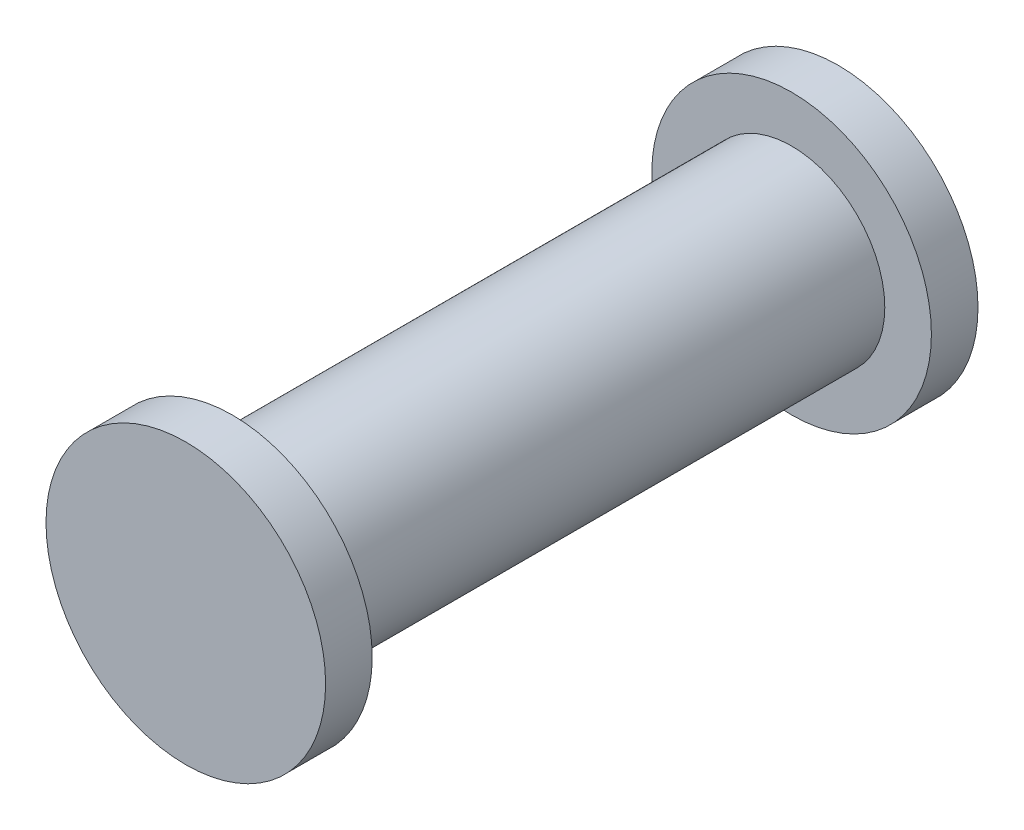
ISO-10303-21;
HEADER;
FILE_DESCRIPTION(('STEP AP214'),'2;1');
FILE_NAME('part.step','',(''),(''),'','','');
FILE_SCHEMA(('AUTOMOTIVE_DESIGN { 1 0 10303 214 1 1 1 1 }'));
ENDSEC;
DATA;
#1=APPLICATION_CONTEXT('core data for automotive mechanical design processes');
#2=APPLICATION_PROTOCOL_DEFINITION('international standard','automotive_design',2000,#1);
#3=PRODUCT_CONTEXT('',#1,'mechanical');
#4=PRODUCT('Part','Part','',(#3));
#5=PRODUCT_RELATED_PRODUCT_CATEGORY('part','',(#4));
#6=PRODUCT_DEFINITION_FORMATION('','',#4);
#7=PRODUCT_DEFINITION_CONTEXT('part definition',#1,'design');
#8=PRODUCT_DEFINITION('design','',#6,#7);
#9=PRODUCT_DEFINITION_SHAPE('','',#8);
#10=(LENGTH_UNIT() NAMED_UNIT(*) SI_UNIT(.MILLI.,.METRE.));
#11=(NAMED_UNIT(*) PLANE_ANGLE_UNIT() SI_UNIT($,.RADIAN.));
#12=(NAMED_UNIT(*) SI_UNIT($,.STERADIAN.) SOLID_ANGLE_UNIT());
#13=UNCERTAINTY_MEASURE_WITH_UNIT(LENGTH_MEASURE(1.E-05),#10,'distance_accuracy_value','');
#14=(GEOMETRIC_REPRESENTATION_CONTEXT(3) GLOBAL_UNCERTAINTY_ASSIGNED_CONTEXT((#13)) GLOBAL_UNIT_ASSIGNED_CONTEXT((#10,
#11,#12)) REPRESENTATION_CONTEXT('',''));
#15=CARTESIAN_POINT('',(0.,0.,0.));
#16=DIRECTION('',(0.,0.,1.));
#17=DIRECTION('',(1.,0.,0.));
#18=AXIS2_PLACEMENT_3D('',#15,#16,#17);
#19=CARTESIAN_POINT('',(0.,0.,60.));
#20=DIRECTION('',(0.,0.,-1.));
#21=DIRECTION('',(-1.,0.,0.));
#22=AXIS2_PLACEMENT_3D('',#19,#20,#21);
#23=CYLINDRICAL_SURFACE('',#22,10.);
#24=CARTESIAN_POINT('',(0.,0.,60.));
#25=DIRECTION('',(0.,0.,1.));
#26=DIRECTION('',(1.,0.,0.));
#27=AXIS2_PLACEMENT_3D('',#24,#25,#26);
#28=CIRCLE('',#27,10.);
#29=CARTESIAN_POINT('',(10.,0.,60.));
#30=VERTEX_POINT('',#29);
#31=EDGE_CURVE('E10',#30,#30,#28,.T.);
#32=ORIENTED_EDGE('',*,*,#31,.F.);
#33=EDGE_LOOP('',(#32));
#34=FACE_BOUND('',#33,.T.);
#35=CARTESIAN_POINT('',(0.,0.,0.));
#36=DIRECTION('',(0.,0.,1.));
#37=DIRECTION('',(1.,0.,0.));
#38=AXIS2_PLACEMENT_3D('',#35,#36,#37);
#39=CIRCLE('',#38,10.);
#40=CARTESIAN_POINT('',(10.,0.,0.));
#41=VERTEX_POINT('',#40);
#42=EDGE_CURVE('E34',#41,#41,#39,.T.);
#43=ORIENTED_EDGE('',*,*,#42,.T.);
#44=EDGE_LOOP('',(#43));
#45=FACE_BOUND('',#44,.T.);
#46=ADVANCED_FACE('F31',(#34,#45),#23,.T.);
#47=CARTESIAN_POINT('',(0.,0.,65.));
#48=DIRECTION('',(0.,0.,-1.));
#49=DIRECTION('',(-1.,0.,0.));
#50=AXIS2_PLACEMENT_3D('',#47,#48,#49);
#51=CYLINDRICAL_SURFACE('',#50,15.);
#52=CARTESIAN_POINT('',(0.,0.,65.));
#53=DIRECTION('',(0.,0.,1.));
#54=DIRECTION('',(1.,0.,0.));
#55=AXIS2_PLACEMENT_3D('',#52,#53,#54);
#56=CIRCLE('',#55,15.);
#57=CARTESIAN_POINT('',(15.,0.,65.));
#58=VERTEX_POINT('',#57);
#59=EDGE_CURVE('E38',#58,#58,#56,.T.);
#60=ORIENTED_EDGE('',*,*,#59,.F.);
#61=EDGE_LOOP('',(#60));
#62=FACE_BOUND('',#61,.T.);
#63=CARTESIAN_POINT('',(0.,0.,60.));
#64=DIRECTION('',(0.,0.,1.));
#65=DIRECTION('',(1.,0.,0.));
#66=AXIS2_PLACEMENT_3D('',#63,#64,#65);
#67=CIRCLE('',#66,15.);
#68=CARTESIAN_POINT('',(15.,0.,60.));
#69=VERTEX_POINT('',#68);
#70=EDGE_CURVE('E42',#69,#69,#67,.T.);
#71=ORIENTED_EDGE('',*,*,#70,.T.);
#72=EDGE_LOOP('',(#71));
#73=FACE_BOUND('',#72,.T.);
#74=ADVANCED_FACE('F79',(#62,#73),#51,.T.);
#75=CARTESIAN_POINT('',(0.,0.,65.));
#76=DIRECTION('',(0.,0.,1.));
#77=DIRECTION('',(1.,0.,0.));
#78=AXIS2_PLACEMENT_3D('',#75,#76,#77);
#79=PLANE('',#78);
#80=ORIENTED_EDGE('',*,*,#59,.T.);
#81=EDGE_LOOP('',(#80));
#82=FACE_BOUND('',#81,.T.);
#83=ADVANCED_FACE('F75',(#82),#79,.T.);
#84=CARTESIAN_POINT('',(0.,0.,60.));
#85=DIRECTION('',(0.,0.,1.));
#86=DIRECTION('',(1.,0.,0.));
#87=AXIS2_PLACEMENT_3D('',#84,#85,#86);
#88=PLANE('',#87);
#89=ORIENTED_EDGE('',*,*,#31,.T.);
#90=EDGE_LOOP('',(#89));
#91=FACE_BOUND('',#90,.T.);
#92=ORIENTED_EDGE('',*,*,#70,.F.);
#93=EDGE_LOOP('',(#92));
#94=FACE_BOUND('',#93,.T.);
#95=ADVANCED_FACE('F67',(#91,#94),#88,.F.);
#96=CARTESIAN_POINT('',(0.,0.,-5.));
#97=DIRECTION('',(0.,0.,1.));
#98=DIRECTION('',(1.,0.,0.));
#99=AXIS2_PLACEMENT_3D('',#96,#97,#98);
#100=CYLINDRICAL_SURFACE('',#99,15.);
#101=CARTESIAN_POINT('',(0.,0.,-5.));
#102=DIRECTION('',(0.,0.,1.));
#103=DIRECTION('',(1.,0.,0.));
#104=AXIS2_PLACEMENT_3D('',#101,#102,#103);
#105=CIRCLE('',#104,15.);
#106=CARTESIAN_POINT('',(15.,0.,-5.));
#107=VERTEX_POINT('',#106);
#108=EDGE_CURVE('E50',#107,#107,#105,.T.);
#109=ORIENTED_EDGE('',*,*,#108,.T.);
#110=EDGE_LOOP('',(#109));
#111=FACE_BOUND('',#110,.T.);
#112=CARTESIAN_POINT('',(0.,0.,0.));
#113=DIRECTION('',(0.,0.,1.));
#114=DIRECTION('',(1.,0.,0.));
#115=AXIS2_PLACEMENT_3D('',#112,#113,#114);
#116=CIRCLE('',#115,15.);
#117=CARTESIAN_POINT('',(15.,0.,0.));
#118=VERTEX_POINT('',#117);
#119=EDGE_CURVE('E47',#118,#118,#116,.T.);
#120=ORIENTED_EDGE('',*,*,#119,.F.);
#121=EDGE_LOOP('',(#120));
#122=FACE_BOUND('',#121,.T.);
#123=ADVANCED_FACE('F65',(#111,#122),#100,.T.);
#124=CARTESIAN_POINT('',(0.,0.,-5.));
#125=DIRECTION('',(0.,0.,-1.));
#126=DIRECTION('',(1.,0.,0.));
#127=AXIS2_PLACEMENT_3D('',#124,#125,#126);
#128=PLANE('',#127);
#129=ORIENTED_EDGE('',*,*,#108,.F.);
#130=EDGE_LOOP('',(#129));
#131=FACE_BOUND('',#130,.T.);
#132=ADVANCED_FACE('F61',(#131),#128,.T.);
#133=CARTESIAN_POINT('',(0.,0.,0.));
#134=DIRECTION('',(0.,0.,-1.));
#135=DIRECTION('',(1.,0.,0.));
#136=AXIS2_PLACEMENT_3D('',#133,#134,#135);
#137=PLANE('',#136);
#138=ORIENTED_EDGE('',*,*,#42,.F.);
#139=EDGE_LOOP('',(#138));
#140=FACE_BOUND('',#139,.T.);
#141=ORIENTED_EDGE('',*,*,#119,.T.);
#142=EDGE_LOOP('',(#141));
#143=FACE_BOUND('',#142,.T.);
#144=ADVANCED_FACE('F58',(#140,#143),#137,.F.);
#145=CLOSED_SHELL('',(#46,#74,#83,#95,#123,#132,#144));
#146=MANIFOLD_SOLID_BREP('B2',#145);
#147=ADVANCED_BREP_SHAPE_REPRESENTATION('',(#18,#146),#14);
#148=SHAPE_DEFINITION_REPRESENTATION(#9,#147);
ENDSEC;
END-ISO-10303-21;
